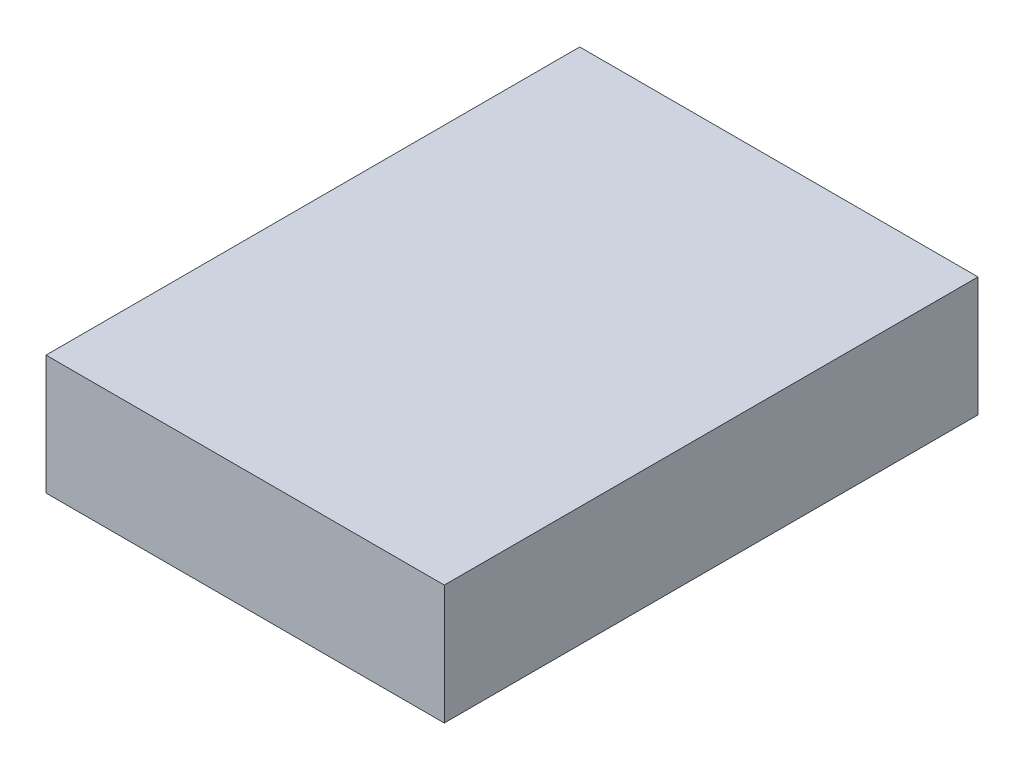
ISO-10303-21;
HEADER;
FILE_DESCRIPTION(('STEP AP214'),'2;1');
FILE_NAME('part.step','',(''),(''),'','','');
FILE_SCHEMA(('AUTOMOTIVE_DESIGN { 1 0 10303 214 1 1 1 1 }'));
ENDSEC;
DATA;
#1=APPLICATION_CONTEXT('core data for automotive mechanical design processes');
#2=APPLICATION_PROTOCOL_DEFINITION('international standard','automotive_design',2000,#1);
#3=PRODUCT_CONTEXT('',#1,'mechanical');
#4=PRODUCT('Part','Part','',(#3));
#5=PRODUCT_RELATED_PRODUCT_CATEGORY('part','',(#4));
#6=PRODUCT_DEFINITION_FORMATION('','',#4);
#7=PRODUCT_DEFINITION_CONTEXT('part definition',#1,'design');
#8=PRODUCT_DEFINITION('design','',#6,#7);
#9=PRODUCT_DEFINITION_SHAPE('','',#8);
#10=(LENGTH_UNIT() NAMED_UNIT(*) SI_UNIT(.MILLI.,.METRE.));
#11=(NAMED_UNIT(*) PLANE_ANGLE_UNIT() SI_UNIT($,.RADIAN.));
#12=(NAMED_UNIT(*) SI_UNIT($,.STERADIAN.) SOLID_ANGLE_UNIT());
#13=UNCERTAINTY_MEASURE_WITH_UNIT(LENGTH_MEASURE(1.E-05),#10,'distance_accuracy_value','');
#14=(GEOMETRIC_REPRESENTATION_CONTEXT(3) GLOBAL_UNCERTAINTY_ASSIGNED_CONTEXT((#13)) GLOBAL_UNIT_ASSIGNED_CONTEXT((#10,
#11,#12)) REPRESENTATION_CONTEXT('',''));
#15=CARTESIAN_POINT('',(0.,0.,0.));
#16=DIRECTION('',(0.,0.,1.));
#17=DIRECTION('',(1.,0.,0.));
#18=AXIS2_PLACEMENT_3D('',#15,#16,#17);
#19=CARTESIAN_POINT('',(-25.,15.,-33.5));
#20=DIRECTION('',(1.,0.,0.));
#21=DIRECTION('',(0.,0.,-1.));
#22=AXIS2_PLACEMENT_3D('',#19,#20,#21);
#23=PLANE('',#22);
#24=DIRECTION('',(0.,0.,1.));
#25=VECTOR('',#24,1.);
#26=CARTESIAN_POINT('',(-25.,0.,-33.5));
#27=LINE('',#26,#25);
#28=CARTESIAN_POINT('',(-25.,0.,-33.5));
#29=VERTEX_POINT('',#28);
#30=CARTESIAN_POINT('',(-25.,0.,33.5));
#31=VERTEX_POINT('',#30);
#32=EDGE_CURVE('E107',#29,#31,#27,.T.);
#33=ORIENTED_EDGE('',*,*,#32,.T.);
#34=DIRECTION('',(0.,-1.,0.));
#35=VECTOR('',#34,1.);
#36=CARTESIAN_POINT('',(-25.,15.,33.5));
#37=LINE('',#36,#35);
#38=CARTESIAN_POINT('',(-25.,15.,33.5));
#39=VERTEX_POINT('',#38);
#40=EDGE_CURVE('E11',#39,#31,#37,.T.);
#41=ORIENTED_EDGE('',*,*,#40,.F.);
#42=DIRECTION('',(0.,0.,1.));
#43=VECTOR('',#42,1.);
#44=CARTESIAN_POINT('',(-25.,15.,-33.5));
#45=LINE('',#44,#43);
#46=CARTESIAN_POINT('',(-25.,15.,-33.5));
#47=VERTEX_POINT('',#46);
#48=EDGE_CURVE('E91',#47,#39,#45,.T.);
#49=ORIENTED_EDGE('',*,*,#48,.F.);
#50=DIRECTION('',(0.,-1.,0.));
#51=VECTOR('',#50,1.);
#52=CARTESIAN_POINT('',(-25.,15.,-33.5));
#53=LINE('',#52,#51);
#54=EDGE_CURVE('E103',#47,#29,#53,.T.);
#55=ORIENTED_EDGE('',*,*,#54,.T.);
#56=EDGE_LOOP('',(#33,#41,#49,#55));
#57=FACE_BOUND('',#56,.T.);
#58=ADVANCED_FACE('F39',(#57),#23,.F.);
#59=CARTESIAN_POINT('',(-25.,15.,33.5));
#60=DIRECTION('',(0.,0.,-1.));
#61=DIRECTION('',(-1.,0.,0.));
#62=AXIS2_PLACEMENT_3D('',#59,#60,#61);
#63=PLANE('',#62);
#64=DIRECTION('',(1.,0.,0.));
#65=VECTOR('',#64,1.);
#66=CARTESIAN_POINT('',(-25.,0.,33.5));
#67=LINE('',#66,#65);
#68=CARTESIAN_POINT('',(25.,0.,33.5));
#69=VERTEX_POINT('',#68);
#70=EDGE_CURVE('E96',#31,#69,#67,.T.);
#71=ORIENTED_EDGE('',*,*,#70,.T.);
#72=DIRECTION('',(0.,-1.,0.));
#73=VECTOR('',#72,1.);
#74=CARTESIAN_POINT('',(25.,15.,33.5));
#75=LINE('',#74,#73);
#76=CARTESIAN_POINT('',(25.,15.,33.5));
#77=VERTEX_POINT('',#76);
#78=EDGE_CURVE('E48',#77,#69,#75,.T.);
#79=ORIENTED_EDGE('',*,*,#78,.F.);
#80=DIRECTION('',(1.,0.,0.));
#81=VECTOR('',#80,1.);
#82=CARTESIAN_POINT('',(-25.,15.,33.5));
#83=LINE('',#82,#81);
#84=EDGE_CURVE('E86',#39,#77,#83,.T.);
#85=ORIENTED_EDGE('',*,*,#84,.F.);
#86=ORIENTED_EDGE('',*,*,#40,.T.);
#87=EDGE_LOOP('',(#71,#79,#85,#86));
#88=FACE_BOUND('',#87,.T.);
#89=ADVANCED_FACE('F95',(#88),#63,.F.);
#90=CARTESIAN_POINT('',(25.,15.,-33.5));
#91=DIRECTION('',(-1.,0.,0.));
#92=DIRECTION('',(0.,0.,1.));
#93=AXIS2_PLACEMENT_3D('',#90,#91,#92);
#94=PLANE('',#93);
#95=DIRECTION('',(0.,0.,-1.));
#96=VECTOR('',#95,1.);
#97=CARTESIAN_POINT('',(25.,0.,-33.5));
#98=LINE('',#97,#96);
#99=CARTESIAN_POINT('',(25.,0.,-33.5));
#100=VERTEX_POINT('',#99);
#101=EDGE_CURVE('E73',#69,#100,#98,.T.);
#102=ORIENTED_EDGE('',*,*,#101,.T.);
#103=DIRECTION('',(0.,-1.,0.));
#104=VECTOR('',#103,1.);
#105=CARTESIAN_POINT('',(25.,15.,-33.5));
#106=LINE('',#105,#104);
#107=CARTESIAN_POINT('',(25.,15.,-33.5));
#108=VERTEX_POINT('',#107);
#109=EDGE_CURVE('E98',#108,#100,#106,.T.);
#110=ORIENTED_EDGE('',*,*,#109,.F.);
#111=DIRECTION('',(0.,0.,-1.));
#112=VECTOR('',#111,1.);
#113=CARTESIAN_POINT('',(25.,15.,-33.5));
#114=LINE('',#113,#112);
#115=EDGE_CURVE('E89',#77,#108,#114,.T.);
#116=ORIENTED_EDGE('',*,*,#115,.F.);
#117=ORIENTED_EDGE('',*,*,#78,.T.);
#118=EDGE_LOOP('',(#102,#110,#116,#117));
#119=FACE_BOUND('',#118,.T.);
#120=ADVANCED_FACE('F99',(#119),#94,.F.);
#121=CARTESIAN_POINT('',(-25.,15.,-33.5));
#122=DIRECTION('',(0.,0.,1.));
#123=DIRECTION('',(1.,0.,0.));
#124=AXIS2_PLACEMENT_3D('',#121,#122,#123);
#125=PLANE('',#124);
#126=DIRECTION('',(-1.,0.,0.));
#127=VECTOR('',#126,1.);
#128=CARTESIAN_POINT('',(-25.,0.,-33.5));
#129=LINE('',#128,#127);
#130=EDGE_CURVE('E79',#100,#29,#129,.T.);
#131=ORIENTED_EDGE('',*,*,#130,.T.);
#132=ORIENTED_EDGE('',*,*,#54,.F.);
#133=DIRECTION('',(-1.,0.,0.));
#134=VECTOR('',#133,1.);
#135=CARTESIAN_POINT('',(-25.,15.,-33.5));
#136=LINE('',#135,#134);
#137=EDGE_CURVE('E56',#108,#47,#136,.T.);
#138=ORIENTED_EDGE('',*,*,#137,.F.);
#139=ORIENTED_EDGE('',*,*,#109,.T.);
#140=EDGE_LOOP('',(#131,#132,#138,#139));
#141=FACE_BOUND('',#140,.T.);
#142=ADVANCED_FACE('F120',(#141),#125,.F.);
#143=CARTESIAN_POINT('',(0.,15.,0.));
#144=DIRECTION('',(0.,1.,0.));
#145=DIRECTION('',(0.,0.,1.));
#146=AXIS2_PLACEMENT_3D('',#143,#144,#145);
#147=PLANE('',#146);
#148=ORIENTED_EDGE('',*,*,#48,.T.);
#149=ORIENTED_EDGE('',*,*,#84,.T.);
#150=ORIENTED_EDGE('',*,*,#115,.T.);
#151=ORIENTED_EDGE('',*,*,#137,.T.);
#152=EDGE_LOOP('',(#148,#149,#150,#151));
#153=FACE_BOUND('',#152,.T.);
#154=ADVANCED_FACE('F87',(#153),#147,.T.);
#155=CARTESIAN_POINT('',(0.,0.,0.));
#156=DIRECTION('',(0.,1.,0.));
#157=DIRECTION('',(0.,0.,1.));
#158=AXIS2_PLACEMENT_3D('',#155,#156,#157);
#159=PLANE('',#158);
#160=ORIENTED_EDGE('',*,*,#32,.F.);
#161=ORIENTED_EDGE('',*,*,#130,.F.);
#162=ORIENTED_EDGE('',*,*,#101,.F.);
#163=ORIENTED_EDGE('',*,*,#70,.F.);
#164=EDGE_LOOP('',(#160,#161,#162,#163));
#165=FACE_BOUND('',#164,.T.);
#166=ADVANCED_FACE('F123',(#165),#159,.F.);
#167=CLOSED_SHELL('',(#58,#89,#120,#142,#154,#166));
#168=MANIFOLD_SOLID_BREP('B2',#167);
#169=ADVANCED_BREP_SHAPE_REPRESENTATION('',(#18,#168),#14);
#170=SHAPE_DEFINITION_REPRESENTATION(#9,#169);
ENDSEC;
END-ISO-10303-21;
